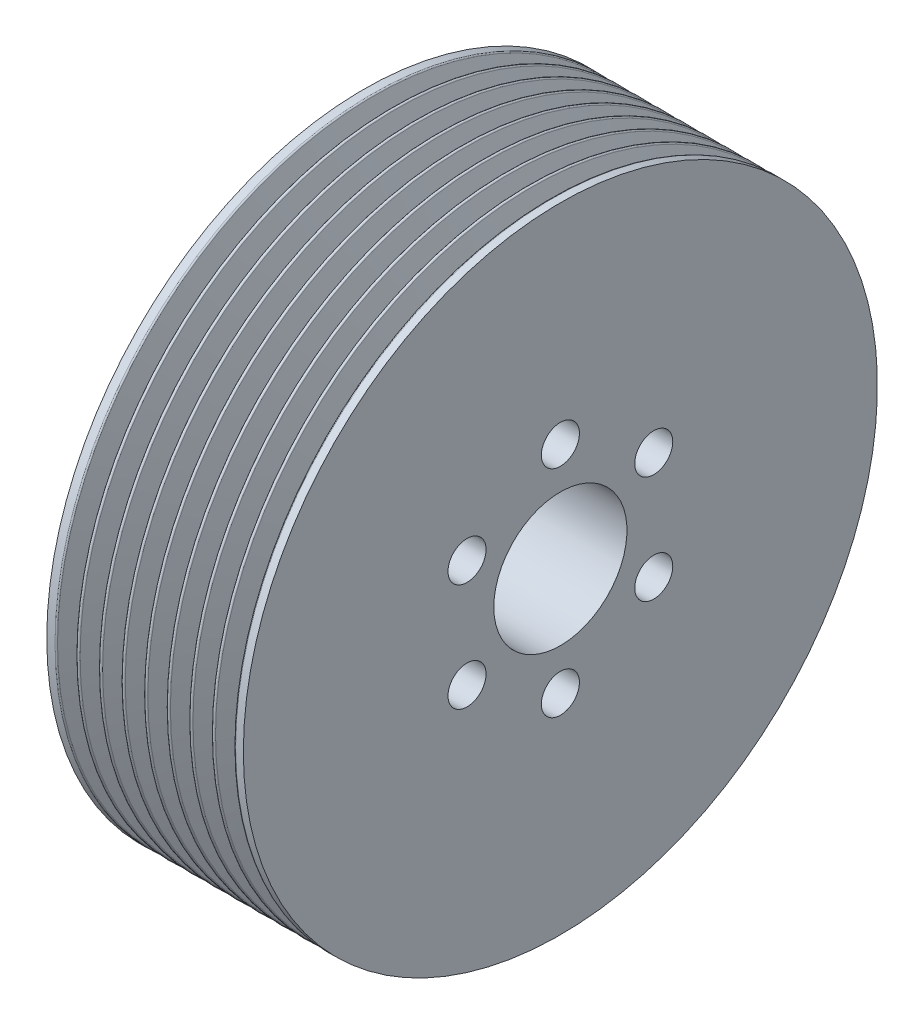
ISO-10303-21;
HEADER;
FILE_DESCRIPTION(('STEP AP214'),'2;1');
FILE_NAME('part.step','',(''),(''),'','','');
FILE_SCHEMA(('AUTOMOTIVE_DESIGN { 1 0 10303 214 1 1 1 1 }'));
ENDSEC;
DATA;
#1=APPLICATION_CONTEXT('core data for automotive mechanical design processes');
#2=APPLICATION_PROTOCOL_DEFINITION('international standard','automotive_design',2000,#1);
#3=PRODUCT_CONTEXT('',#1,'mechanical');
#4=PRODUCT('Part','Part','',(#3));
#5=PRODUCT_RELATED_PRODUCT_CATEGORY('part','',(#4));
#6=PRODUCT_DEFINITION_FORMATION('','',#4);
#7=PRODUCT_DEFINITION_CONTEXT('part definition',#1,'design');
#8=PRODUCT_DEFINITION('design','',#6,#7);
#9=PRODUCT_DEFINITION_SHAPE('','',#8);
#10=(LENGTH_UNIT() NAMED_UNIT(*) SI_UNIT(.MILLI.,.METRE.));
#11=(NAMED_UNIT(*) PLANE_ANGLE_UNIT() SI_UNIT($,.RADIAN.));
#12=(NAMED_UNIT(*) SI_UNIT($,.STERADIAN.) SOLID_ANGLE_UNIT());
#13=UNCERTAINTY_MEASURE_WITH_UNIT(LENGTH_MEASURE(1.E-05),#10,'distance_accuracy_value','');
#14=(GEOMETRIC_REPRESENTATION_CONTEXT(3) GLOBAL_UNCERTAINTY_ASSIGNED_CONTEXT((#13)) GLOBAL_UNIT_ASSIGNED_CONTEXT((#10,
#11,#12)) REPRESENTATION_CONTEXT('',''));
#15=CARTESIAN_POINT('',(0.,0.,0.));
#16=DIRECTION('',(0.,0.,1.));
#17=DIRECTION('',(1.,0.,0.));
#18=AXIS2_PLACEMENT_3D('',#15,#16,#17);
#19=CARTESIAN_POINT('',(0.,0.,0.));
#20=DIRECTION('',(-1.,0.,0.));
#21=DIRECTION('',(0.,0.,1.));
#22=AXIS2_PLACEMENT_3D('',#19,#20,#21);
#23=CYLINDRICAL_SURFACE('',#22,50.);
#24=CARTESIAN_POINT('',(18.,0.,0.));
#25=DIRECTION('',(-1.,0.,0.));
#26=DIRECTION('',(0.,0.,1.));
#27=AXIS2_PLACEMENT_3D('',#24,#25,#26);
#28=CIRCLE('',#27,50.);
#29=CARTESIAN_POINT('',(18.,0.,50.));
#30=VERTEX_POINT('',#29);
#31=EDGE_CURVE('E54',#30,#30,#28,.T.);
#32=ORIENTED_EDGE('',*,*,#31,.F.);
#33=EDGE_LOOP('',(#32));
#34=FACE_BOUND('',#33,.T.);
#35=CARTESIAN_POINT('',(19.3,0.,0.));
#36=DIRECTION('',(-1.,0.,0.));
#37=DIRECTION('',(0.,0.,1.));
#38=AXIS2_PLACEMENT_3D('',#35,#36,#37);
#39=CIRCLE('',#38,50.);
#40=CARTESIAN_POINT('',(19.3,0.,50.));
#41=VERTEX_POINT('',#40);
#42=EDGE_CURVE('E205',#41,#41,#39,.T.);
#43=ORIENTED_EDGE('',*,*,#42,.T.);
#44=EDGE_LOOP('',(#43));
#45=FACE_BOUND('',#44,.T.);
#46=ADVANCED_FACE('F41',(#34,#45),#23,.T.);
#47=CARTESIAN_POINT('',(31.5,10.5,0.));
#48=DIRECTION('',(1.,0.,0.));
#49=DIRECTION('',(0.,0.,-1.));
#50=AXIS2_PLACEMENT_3D('',#47,#48,#49);
#51=PLANE('',#50);
#52=CARTESIAN_POINT('',(31.5,8.50000000000017,14.7224318643354));
#53=DIRECTION('',(1.,0.,0.));
#54=DIRECTION('',(0.,0.,-1.));
#55=AXIS2_PLACEMENT_3D('',#52,#53,#54);
#56=CIRCLE('',#55,3.);
#57=CARTESIAN_POINT('',(31.5,8.50000000000017,11.7224318643354));
#58=VERTEX_POINT('',#57);
#59=EDGE_CURVE('E249',#58,#58,#56,.F.);
#60=ORIENTED_EDGE('',*,*,#59,.F.);
#61=EDGE_LOOP('',(#60));
#62=FACE_BOUND('',#61,.T.);
#63=CARTESIAN_POINT('',(31.5,-8.50000000000004,14.7224318643355));
#64=DIRECTION('',(1.,0.,0.));
#65=DIRECTION('',(0.,0.,-1.));
#66=AXIS2_PLACEMENT_3D('',#63,#64,#65);
#67=CIRCLE('',#66,3.);
#68=CARTESIAN_POINT('',(31.5,-8.50000000000004,11.7224318643355));
#69=VERTEX_POINT('',#68);
#70=EDGE_CURVE('E241',#69,#69,#67,.F.);
#71=ORIENTED_EDGE('',*,*,#70,.F.);
#72=EDGE_LOOP('',(#71));
#73=FACE_BOUND('',#72,.T.);
#74=CARTESIAN_POINT('',(31.5,-17.0000000000001,0.));
#75=DIRECTION('',(1.,0.,0.));
#76=DIRECTION('',(0.,0.,-1.));
#77=AXIS2_PLACEMENT_3D('',#74,#75,#76);
#78=CIRCLE('',#77,3.);
#79=CARTESIAN_POINT('',(31.5,-17.0000000000001,-2.99999999999996));
#80=VERTEX_POINT('',#79);
#81=EDGE_CURVE('E233',#80,#80,#78,.F.);
#82=ORIENTED_EDGE('',*,*,#81,.F.);
#83=EDGE_LOOP('',(#82));
#84=FACE_BOUND('',#83,.T.);
#85=CARTESIAN_POINT('',(31.5,-8.49999999999999,-14.7224318643355));
#86=DIRECTION('',(1.,0.,0.));
#87=DIRECTION('',(0.,0.,-1.));
#88=AXIS2_PLACEMENT_3D('',#85,#86,#87);
#89=CIRCLE('',#88,3.);
#90=CARTESIAN_POINT('',(31.5,-8.49999999999999,-17.7224318643355));
#91=VERTEX_POINT('',#90);
#92=EDGE_CURVE('E225',#91,#91,#89,.F.);
#93=ORIENTED_EDGE('',*,*,#92,.F.);
#94=EDGE_LOOP('',(#93));
#95=FACE_BOUND('',#94,.T.);
#96=CARTESIAN_POINT('',(31.5,8.5,-14.7224318643355));
#97=DIRECTION('',(1.,0.,0.));
#98=DIRECTION('',(0.,0.,-1.));
#99=AXIS2_PLACEMENT_3D('',#96,#97,#98);
#100=CIRCLE('',#99,3.);
#101=CARTESIAN_POINT('',(31.5,8.5,-17.7224318643355));
#102=VERTEX_POINT('',#101);
#103=EDGE_CURVE('E217',#102,#102,#100,.F.);
#104=ORIENTED_EDGE('',*,*,#103,.F.);
#105=EDGE_LOOP('',(#104));
#106=FACE_BOUND('',#105,.T.);
#107=CARTESIAN_POINT('',(31.5,17.,0.));
#108=DIRECTION('',(1.,0.,0.));
#109=DIRECTION('',(0.,0.,-1.));
#110=AXIS2_PLACEMENT_3D('',#107,#108,#109);
#111=CIRCLE('',#110,3.);
#112=CARTESIAN_POINT('',(31.5,17.,-3.));
#113=VERTEX_POINT('',#112);
#114=EDGE_CURVE('E209',#113,#113,#111,.F.);
#115=ORIENTED_EDGE('',*,*,#114,.F.);
#116=EDGE_LOOP('',(#115));
#117=FACE_BOUND('',#116,.T.);
#118=CARTESIAN_POINT('',(31.5,0.,0.));
#119=DIRECTION('',(-1.,0.,0.));
#120=DIRECTION('',(0.,0.,1.));
#121=AXIS2_PLACEMENT_3D('',#118,#119,#120);
#122=CIRCLE('',#121,10.5);
#123=CARTESIAN_POINT('',(31.5,0.,10.5));
#124=VERTEX_POINT('',#123);
#125=EDGE_CURVE('E69',#124,#124,#122,.T.);
#126=ORIENTED_EDGE('',*,*,#125,.F.);
#127=EDGE_LOOP('',(#126));
#128=FACE_BOUND('',#127,.T.);
#129=CARTESIAN_POINT('',(31.5,0.,0.));
#130=DIRECTION('',(-1.,0.,0.));
#131=DIRECTION('',(0.,0.,1.));
#132=AXIS2_PLACEMENT_3D('',#129,#130,#131);
#133=CIRCLE('',#132,21.5);
#134=CARTESIAN_POINT('',(31.5,0.,21.5));
#135=VERTEX_POINT('',#134);
#136=EDGE_CURVE('E10',#135,#135,#133,.T.);
#137=ORIENTED_EDGE('',*,*,#136,.T.);
#138=EDGE_LOOP('',(#137));
#139=FACE_BOUND('',#138,.T.);
#140=ADVANCED_FACE('F43',(#62,#73,#84,#95,#106,#117,#128,#139),#51,.F.);
#141=CARTESIAN_POINT('',(0.,0.,0.));
#142=DIRECTION('',(-1.,0.,0.));
#143=DIRECTION('',(0.,0.,1.));
#144=AXIS2_PLACEMENT_3D('',#141,#142,#143);
#145=CYLINDRICAL_SURFACE('',#144,21.5);
#146=ORIENTED_EDGE('',*,*,#136,.F.);
#147=EDGE_LOOP('',(#146));
#148=FACE_BOUND('',#147,.T.);
#149=CARTESIAN_POINT('',(18.,0.,0.));
#150=DIRECTION('',(-1.,0.,0.));
#151=DIRECTION('',(0.,0.,1.));
#152=AXIS2_PLACEMENT_3D('',#149,#150,#151);
#153=CIRCLE('',#152,21.5);
#154=CARTESIAN_POINT('',(18.,0.,21.5));
#155=VERTEX_POINT('',#154);
#156=EDGE_CURVE('E49',#155,#155,#153,.T.);
#157=ORIENTED_EDGE('',*,*,#156,.T.);
#158=EDGE_LOOP('',(#157));
#159=FACE_BOUND('',#158,.T.);
#160=ADVANCED_FACE('F287',(#148,#159),#145,.F.);
#161=CARTESIAN_POINT('',(18.,50.,0.));
#162=DIRECTION('',(1.,0.,0.));
#163=DIRECTION('',(0.,0.,-1.));
#164=AXIS2_PLACEMENT_3D('',#161,#162,#163);
#165=PLANE('',#164);
#166=ORIENTED_EDGE('',*,*,#156,.F.);
#167=EDGE_LOOP('',(#166));
#168=FACE_BOUND('',#167,.T.);
#169=ORIENTED_EDGE('',*,*,#31,.T.);
#170=EDGE_LOOP('',(#169));
#171=FACE_BOUND('',#170,.T.);
#172=ADVANCED_FACE('F293',(#168,#171),#165,.F.);
#173=CARTESIAN_POINT('',(47.78,0.,0.));
#174=DIRECTION('',(-1.,0.,0.));
#175=DIRECTION('',(0.,0.,1.));
#176=AXIS2_PLACEMENT_3D('',#173,#174,#175);
#177=CIRCLE('',#176,50.);
#178=CARTESIAN_POINT('',(47.78,0.,50.));
#179=VERTEX_POINT('',#178);
#180=EDGE_CURVE('E89',#179,#179,#177,.T.);
#181=ORIENTED_EDGE('',*,*,#180,.F.);
#182=EDGE_LOOP('',(#181));
#183=FACE_BOUND('',#182,.T.);
#184=CARTESIAN_POINT('',(49.,0.,0.));
#185=DIRECTION('',(-1.,0.,0.));
#186=DIRECTION('',(0.,0.,1.));
#187=AXIS2_PLACEMENT_3D('',#184,#185,#186);
#188=CIRCLE('',#187,50.);
#189=CARTESIAN_POINT('',(49.,0.,50.));
#190=VERTEX_POINT('',#189);
#191=EDGE_CURVE('E59',#190,#190,#188,.T.);
#192=ORIENTED_EDGE('',*,*,#191,.T.);
#193=EDGE_LOOP('',(#192));
#194=FACE_BOUND('',#193,.T.);
#195=ADVANCED_FACE('F264',(#183,#194),#23,.T.);
#196=CARTESIAN_POINT('',(49.,10.5,0.));
#197=DIRECTION('',(-1.,0.,0.));
#198=DIRECTION('',(0.,0.,1.));
#199=AXIS2_PLACEMENT_3D('',#196,#197,#198);
#200=PLANE('',#199);
#201=CARTESIAN_POINT('',(49.,8.50000000000017,14.7224318643354));
#202=DIRECTION('',(1.,0.,0.));
#203=DIRECTION('',(0.,0.,-1.));
#204=AXIS2_PLACEMENT_3D('',#201,#202,#203);
#205=CIRCLE('',#204,3.);
#206=CARTESIAN_POINT('',(49.,8.50000000000017,11.7224318643354));
#207=VERTEX_POINT('',#206);
#208=EDGE_CURVE('E253',#207,#207,#205,.T.);
#209=ORIENTED_EDGE('',*,*,#208,.F.);
#210=EDGE_LOOP('',(#209));
#211=FACE_BOUND('',#210,.T.);
#212=CARTESIAN_POINT('',(49.,-8.50000000000004,14.7224318643355));
#213=DIRECTION('',(1.,0.,0.));
#214=DIRECTION('',(0.,0.,-1.));
#215=AXIS2_PLACEMENT_3D('',#212,#213,#214);
#216=CIRCLE('',#215,3.);
#217=CARTESIAN_POINT('',(49.,-8.50000000000004,11.7224318643355));
#218=VERTEX_POINT('',#217);
#219=EDGE_CURVE('E245',#218,#218,#216,.T.);
#220=ORIENTED_EDGE('',*,*,#219,.F.);
#221=EDGE_LOOP('',(#220));
#222=FACE_BOUND('',#221,.T.);
#223=CARTESIAN_POINT('',(49.,-17.0000000000001,0.));
#224=DIRECTION('',(1.,0.,0.));
#225=DIRECTION('',(0.,0.,-1.));
#226=AXIS2_PLACEMENT_3D('',#223,#224,#225);
#227=CIRCLE('',#226,3.);
#228=CARTESIAN_POINT('',(49.,-17.0000000000001,-2.99999999999996));
#229=VERTEX_POINT('',#228);
#230=EDGE_CURVE('E237',#229,#229,#227,.T.);
#231=ORIENTED_EDGE('',*,*,#230,.F.);
#232=EDGE_LOOP('',(#231));
#233=FACE_BOUND('',#232,.T.);
#234=CARTESIAN_POINT('',(49.,-8.49999999999999,-14.7224318643355));
#235=DIRECTION('',(1.,0.,0.));
#236=DIRECTION('',(0.,0.,-1.));
#237=AXIS2_PLACEMENT_3D('',#234,#235,#236);
#238=CIRCLE('',#237,3.);
#239=CARTESIAN_POINT('',(49.,-8.49999999999999,-17.7224318643355));
#240=VERTEX_POINT('',#239);
#241=EDGE_CURVE('E229',#240,#240,#238,.T.);
#242=ORIENTED_EDGE('',*,*,#241,.F.);
#243=EDGE_LOOP('',(#242));
#244=FACE_BOUND('',#243,.T.);
#245=CARTESIAN_POINT('',(49.,8.5,-14.7224318643355));
#246=DIRECTION('',(1.,0.,0.));
#247=DIRECTION('',(0.,0.,-1.));
#248=AXIS2_PLACEMENT_3D('',#245,#246,#247);
#249=CIRCLE('',#248,3.);
#250=CARTESIAN_POINT('',(49.,8.5,-17.7224318643355));
#251=VERTEX_POINT('',#250);
#252=EDGE_CURVE('E221',#251,#251,#249,.T.);
#253=ORIENTED_EDGE('',*,*,#252,.F.);
#254=EDGE_LOOP('',(#253));
#255=FACE_BOUND('',#254,.T.);
#256=CARTESIAN_POINT('',(49.,17.,0.));
#257=DIRECTION('',(1.,0.,0.));
#258=DIRECTION('',(0.,0.,-1.));
#259=AXIS2_PLACEMENT_3D('',#256,#257,#258);
#260=CIRCLE('',#259,3.);
#261=CARTESIAN_POINT('',(49.,17.,-3.));
#262=VERTEX_POINT('',#261);
#263=EDGE_CURVE('E213',#262,#262,#260,.T.);
#264=ORIENTED_EDGE('',*,*,#263,.F.);
#265=EDGE_LOOP('',(#264));
#266=FACE_BOUND('',#265,.T.);
#267=ORIENTED_EDGE('',*,*,#191,.F.);
#268=EDGE_LOOP('',(#267));
#269=FACE_BOUND('',#268,.T.);
#270=CARTESIAN_POINT('',(49.,0.,0.));
#271=DIRECTION('',(-1.,0.,0.));
#272=DIRECTION('',(0.,0.,1.));
#273=AXIS2_PLACEMENT_3D('',#270,#271,#272);
#274=CIRCLE('',#273,10.5);
#275=CARTESIAN_POINT('',(49.,0.,10.5));
#276=VERTEX_POINT('',#275);
#277=EDGE_CURVE('E65',#276,#276,#274,.T.);
#278=ORIENTED_EDGE('',*,*,#277,.T.);
#279=EDGE_LOOP('',(#278));
#280=FACE_BOUND('',#279,.T.);
#281=ADVANCED_FACE('F260',(#211,#222,#233,#244,#255,#266,#269,#280),#200,.F.);
#282=CARTESIAN_POINT('',(0.,0.,0.));
#283=DIRECTION('',(-1.,0.,0.));
#284=DIRECTION('',(0.,0.,1.));
#285=AXIS2_PLACEMENT_3D('',#282,#283,#284);
#286=CYLINDRICAL_SURFACE('',#285,10.5);
#287=ORIENTED_EDGE('',*,*,#277,.F.);
#288=EDGE_LOOP('',(#287));
#289=FACE_BOUND('',#288,.T.);
#290=ORIENTED_EDGE('',*,*,#125,.T.);
#291=EDGE_LOOP('',(#290));
#292=FACE_BOUND('',#291,.T.);
#293=ADVANCED_FACE('F263',(#289,#292),#286,.F.);
#294=CARTESIAN_POINT('',(47.78,0.,0.));
#295=DIRECTION('',(-1.,0.,0.));
#296=DIRECTION('',(0.,0.,1.));
#297=AXIS2_PLACEMENT_3D('',#294,#295,#296);
#298=TOROIDAL_SURFACE('',#297,49.75,0.250000000000001);
#299=ORIENTED_EDGE('',*,*,#180,.T.);
#300=EDGE_LOOP('',(#299));
#301=FACE_BOUND('',#300,.T.);
#302=CARTESIAN_POINT('',(47.5450768448035,0.,0.));
#303=DIRECTION('',(-1.,0.,0.));
#304=DIRECTION('',(0.,0.,1.));
#305=AXIS2_PLACEMENT_3D('',#302,#303,#304);
#306=CIRCLE('',#305,49.8355050358314);
#307=CARTESIAN_POINT('',(47.5450768448035,0.,49.8355050358314));
#308=VERTEX_POINT('',#307);
#309=EDGE_CURVE('E73',#308,#308,#306,.T.);
#310=ORIENTED_EDGE('',*,*,#309,.F.);
#311=EDGE_LOOP('',(#310));
#312=FACE_BOUND('',#311,.T.);
#313=ADVANCED_FACE('F282',(#301,#312),#298,.T.);
#314=CARTESIAN_POINT('',(46.2819077862358,0.,0.));
#315=DIRECTION('',(1.,0.,0.));
#316=DIRECTION('',(0.,0.,-1.));
#317=AXIS2_PLACEMENT_3D('',#314,#315,#316);
#318=CONICAL_SURFACE('',#317,46.3649765704627,1.22173047639603);
#319=ORIENTED_EDGE('',*,*,#309,.T.);
#320=EDGE_LOOP('',(#319));
#321=FACE_BOUND('',#320,.T.);
#322=CARTESIAN_POINT('',(46.2819077862358,0.,0.));
#323=DIRECTION('',(-1.,0.,0.));
#324=DIRECTION('',(0.,0.,1.));
#325=AXIS2_PLACEMENT_3D('',#322,#323,#324);
#326=CIRCLE('',#325,46.3649765704627);
#327=CARTESIAN_POINT('',(46.2819077862358,0.,46.3649765704627));
#328=VERTEX_POINT('',#327);
#329=EDGE_CURVE('E77',#328,#328,#326,.T.);
#330=ORIENTED_EDGE('',*,*,#329,.F.);
#331=EDGE_LOOP('',(#330));
#332=FACE_BOUND('',#331,.T.);
#333=ADVANCED_FACE('F445',(#321,#332),#318,.T.);
#334=CARTESIAN_POINT('',(46.,0.,0.));
#335=DIRECTION('',(-1.,0.,0.));
#336=DIRECTION('',(0.,0.,1.));
#337=AXIS2_PLACEMENT_3D('',#334,#335,#336);
#338=TOROIDAL_SURFACE('',#337,46.4675826134604,0.3);
#339=ORIENTED_EDGE('',*,*,#329,.T.);
#340=EDGE_LOOP('',(#339));
#341=FACE_BOUND('',#340,.T.);
#342=CARTESIAN_POINT('',(45.7180922137642,0.,0.));
#343=DIRECTION('',(-1.,0.,0.));
#344=DIRECTION('',(0.,0.,1.));
#345=AXIS2_PLACEMENT_3D('',#342,#343,#344);
#346=CIRCLE('',#345,46.3649765704627);
#347=CARTESIAN_POINT('',(45.7180922137642,0.,46.3649765704627));
#348=VERTEX_POINT('',#347);
#349=EDGE_CURVE('E81',#348,#348,#346,.T.);
#350=ORIENTED_EDGE('',*,*,#349,.F.);
#351=EDGE_LOOP('',(#350));
#352=FACE_BOUND('',#351,.T.);
#353=ADVANCED_FACE('F441',(#341,#352),#338,.F.);
#354=CARTESIAN_POINT('',(44.4549231551965,0.,0.));
#355=DIRECTION('',(-1.,0.,0.));
#356=DIRECTION('',(0.,0.,1.));
#357=AXIS2_PLACEMENT_3D('',#354,#355,#356);
#358=CONICAL_SURFACE('',#357,49.8355050358314,1.22173047639604);
#359=ORIENTED_EDGE('',*,*,#349,.T.);
#360=EDGE_LOOP('',(#359));
#361=FACE_BOUND('',#360,.T.);
#362=CARTESIAN_POINT('',(44.4549231551965,0.,0.));
#363=DIRECTION('',(-1.,0.,0.));
#364=DIRECTION('',(0.,0.,1.));
#365=AXIS2_PLACEMENT_3D('',#362,#363,#364);
#366=CIRCLE('',#365,49.8355050358314);
#367=CARTESIAN_POINT('',(44.4549231551965,0.,49.8355050358314));
#368=VERTEX_POINT('',#367);
#369=EDGE_CURVE('E85',#368,#368,#366,.T.);
#370=ORIENTED_EDGE('',*,*,#369,.F.);
#371=EDGE_LOOP('',(#370));
#372=FACE_BOUND('',#371,.T.);
#373=ADVANCED_FACE('F437',(#361,#372),#358,.T.);
#374=CARTESIAN_POINT('',(44.22,0.,0.));
#375=DIRECTION('',(-1.,0.,0.));
#376=DIRECTION('',(0.,0.,1.));
#377=AXIS2_PLACEMENT_3D('',#374,#375,#376);
#378=TOROIDAL_SURFACE('',#377,49.75,0.250000000000001);
#379=ORIENTED_EDGE('',*,*,#369,.T.);
#380=EDGE_LOOP('',(#379));
#381=FACE_BOUND('',#380,.T.);
#382=CARTESIAN_POINT('',(43.9850768448035,0.,0.));
#383=DIRECTION('',(-1.,0.,0.));
#384=DIRECTION('',(0.,0.,1.));
#385=AXIS2_PLACEMENT_3D('',#382,#383,#384);
#386=CIRCLE('',#385,49.8355050358314);
#387=CARTESIAN_POINT('',(43.9850768448035,0.,49.8355050358314));
#388=VERTEX_POINT('',#387);
#389=EDGE_CURVE('E93',#388,#388,#386,.T.);
#390=ORIENTED_EDGE('',*,*,#389,.F.);
#391=EDGE_LOOP('',(#390));
#392=FACE_BOUND('',#391,.T.);
#393=ADVANCED_FACE('F433',(#381,#392),#378,.T.);
#394=CARTESIAN_POINT('',(42.7219077862358,0.,0.));
#395=DIRECTION('',(1.,0.,0.));
#396=DIRECTION('',(0.,0.,-1.));
#397=AXIS2_PLACEMENT_3D('',#394,#395,#396);
#398=CONICAL_SURFACE('',#397,46.3649765704627,1.22173047639603);
#399=ORIENTED_EDGE('',*,*,#389,.T.);
#400=EDGE_LOOP('',(#399));
#401=FACE_BOUND('',#400,.T.);
#402=CARTESIAN_POINT('',(42.7219077862358,0.,0.));
#403=DIRECTION('',(-1.,0.,0.));
#404=DIRECTION('',(0.,0.,1.));
#405=AXIS2_PLACEMENT_3D('',#402,#403,#404);
#406=CIRCLE('',#405,46.3649765704627);
#407=CARTESIAN_POINT('',(42.7219077862358,0.,46.3649765704627));
#408=VERTEX_POINT('',#407);
#409=EDGE_CURVE('E97',#408,#408,#406,.T.);
#410=ORIENTED_EDGE('',*,*,#409,.F.);
#411=EDGE_LOOP('',(#410));
#412=FACE_BOUND('',#411,.T.);
#413=ADVANCED_FACE('F429',(#401,#412),#398,.T.);
#414=CARTESIAN_POINT('',(42.44,0.,0.));
#415=DIRECTION('',(-1.,0.,0.));
#416=DIRECTION('',(0.,0.,1.));
#417=AXIS2_PLACEMENT_3D('',#414,#415,#416);
#418=TOROIDAL_SURFACE('',#417,46.4675826134604,0.3);
#419=ORIENTED_EDGE('',*,*,#409,.T.);
#420=EDGE_LOOP('',(#419));
#421=FACE_BOUND('',#420,.T.);
#422=CARTESIAN_POINT('',(42.1580922137642,0.,0.));
#423=DIRECTION('',(-1.,0.,0.));
#424=DIRECTION('',(0.,0.,1.));
#425=AXIS2_PLACEMENT_3D('',#422,#423,#424);
#426=CIRCLE('',#425,46.3649765704627);
#427=CARTESIAN_POINT('',(42.1580922137642,0.,46.3649765704627));
#428=VERTEX_POINT('',#427);
#429=EDGE_CURVE('E101',#428,#428,#426,.T.);
#430=ORIENTED_EDGE('',*,*,#429,.F.);
#431=EDGE_LOOP('',(#430));
#432=FACE_BOUND('',#431,.T.);
#433=ADVANCED_FACE('F425',(#421,#432),#418,.F.);
#434=CARTESIAN_POINT('',(40.8949231551965,0.,0.));
#435=DIRECTION('',(-1.,0.,0.));
#436=DIRECTION('',(0.,0.,1.));
#437=AXIS2_PLACEMENT_3D('',#434,#435,#436);
#438=CONICAL_SURFACE('',#437,49.8355050358314,1.22173047639604);
#439=ORIENTED_EDGE('',*,*,#429,.T.);
#440=EDGE_LOOP('',(#439));
#441=FACE_BOUND('',#440,.T.);
#442=CARTESIAN_POINT('',(40.8949231551965,0.,0.));
#443=DIRECTION('',(-1.,0.,0.));
#444=DIRECTION('',(0.,0.,1.));
#445=AXIS2_PLACEMENT_3D('',#442,#443,#444);
#446=CIRCLE('',#445,49.8355050358314);
#447=CARTESIAN_POINT('',(40.8949231551965,0.,49.8355050358314));
#448=VERTEX_POINT('',#447);
#449=EDGE_CURVE('E105',#448,#448,#446,.T.);
#450=ORIENTED_EDGE('',*,*,#449,.F.);
#451=EDGE_LOOP('',(#450));
#452=FACE_BOUND('',#451,.T.);
#453=ADVANCED_FACE('F421',(#441,#452),#438,.T.);
#454=CARTESIAN_POINT('',(40.66,0.,0.));
#455=DIRECTION('',(-1.,0.,0.));
#456=DIRECTION('',(0.,0.,1.));
#457=AXIS2_PLACEMENT_3D('',#454,#455,#456);
#458=TOROIDAL_SURFACE('',#457,49.75,0.250000000000001);
#459=ORIENTED_EDGE('',*,*,#449,.T.);
#460=EDGE_LOOP('',(#459));
#461=FACE_BOUND('',#460,.T.);
#462=CARTESIAN_POINT('',(40.4250768448035,0.,0.));
#463=DIRECTION('',(-1.,0.,0.));
#464=DIRECTION('',(0.,0.,1.));
#465=AXIS2_PLACEMENT_3D('',#462,#463,#464);
#466=CIRCLE('',#465,49.8355050358314);
#467=CARTESIAN_POINT('',(40.4250768448035,0.,49.8355050358314));
#468=VERTEX_POINT('',#467);
#469=EDGE_CURVE('E109',#468,#468,#466,.T.);
#470=ORIENTED_EDGE('',*,*,#469,.F.);
#471=EDGE_LOOP('',(#470));
#472=FACE_BOUND('',#471,.T.);
#473=ADVANCED_FACE('F417',(#461,#472),#458,.T.);
#474=CARTESIAN_POINT('',(39.1619077862358,0.,0.));
#475=DIRECTION('',(1.,0.,0.));
#476=DIRECTION('',(0.,0.,-1.));
#477=AXIS2_PLACEMENT_3D('',#474,#475,#476);
#478=CONICAL_SURFACE('',#477,46.3649765704627,1.22173047639603);
#479=ORIENTED_EDGE('',*,*,#469,.T.);
#480=EDGE_LOOP('',(#479));
#481=FACE_BOUND('',#480,.T.);
#482=CARTESIAN_POINT('',(39.1619077862358,0.,0.));
#483=DIRECTION('',(-1.,0.,0.));
#484=DIRECTION('',(0.,0.,1.));
#485=AXIS2_PLACEMENT_3D('',#482,#483,#484);
#486=CIRCLE('',#485,46.3649765704627);
#487=CARTESIAN_POINT('',(39.1619077862358,0.,46.3649765704627));
#488=VERTEX_POINT('',#487);
#489=EDGE_CURVE('E113',#488,#488,#486,.T.);
#490=ORIENTED_EDGE('',*,*,#489,.F.);
#491=EDGE_LOOP('',(#490));
#492=FACE_BOUND('',#491,.T.);
#493=ADVANCED_FACE('F413',(#481,#492),#478,.T.);
#494=CARTESIAN_POINT('',(38.88,0.,0.));
#495=DIRECTION('',(-1.,0.,0.));
#496=DIRECTION('',(0.,0.,1.));
#497=AXIS2_PLACEMENT_3D('',#494,#495,#496);
#498=TOROIDAL_SURFACE('',#497,46.4675826134604,0.3);
#499=ORIENTED_EDGE('',*,*,#489,.T.);
#500=EDGE_LOOP('',(#499));
#501=FACE_BOUND('',#500,.T.);
#502=CARTESIAN_POINT('',(38.5980922137642,0.,0.));
#503=DIRECTION('',(-1.,0.,0.));
#504=DIRECTION('',(0.,0.,1.));
#505=AXIS2_PLACEMENT_3D('',#502,#503,#504);
#506=CIRCLE('',#505,46.3649765704627);
#507=CARTESIAN_POINT('',(38.5980922137642,0.,46.3649765704627));
#508=VERTEX_POINT('',#507);
#509=EDGE_CURVE('E117',#508,#508,#506,.T.);
#510=ORIENTED_EDGE('',*,*,#509,.F.);
#511=EDGE_LOOP('',(#510));
#512=FACE_BOUND('',#511,.T.);
#513=ADVANCED_FACE('F409',(#501,#512),#498,.F.);
#514=CARTESIAN_POINT('',(37.3349231551965,0.,0.));
#515=DIRECTION('',(-1.,0.,0.));
#516=DIRECTION('',(0.,0.,1.));
#517=AXIS2_PLACEMENT_3D('',#514,#515,#516);
#518=CONICAL_SURFACE('',#517,49.8355050358314,1.22173047639604);
#519=ORIENTED_EDGE('',*,*,#509,.T.);
#520=EDGE_LOOP('',(#519));
#521=FACE_BOUND('',#520,.T.);
#522=CARTESIAN_POINT('',(37.3349231551965,0.,0.));
#523=DIRECTION('',(-1.,0.,0.));
#524=DIRECTION('',(0.,0.,1.));
#525=AXIS2_PLACEMENT_3D('',#522,#523,#524);
#526=CIRCLE('',#525,49.8355050358314);
#527=CARTESIAN_POINT('',(37.3349231551965,0.,49.8355050358314));
#528=VERTEX_POINT('',#527);
#529=EDGE_CURVE('E121',#528,#528,#526,.T.);
#530=ORIENTED_EDGE('',*,*,#529,.F.);
#531=EDGE_LOOP('',(#530));
#532=FACE_BOUND('',#531,.T.);
#533=ADVANCED_FACE('F405',(#521,#532),#518,.T.);
#534=CARTESIAN_POINT('',(37.1,0.,0.));
#535=DIRECTION('',(-1.,0.,0.));
#536=DIRECTION('',(0.,0.,1.));
#537=AXIS2_PLACEMENT_3D('',#534,#535,#536);
#538=TOROIDAL_SURFACE('',#537,49.75,0.250000000000001);
#539=ORIENTED_EDGE('',*,*,#529,.T.);
#540=EDGE_LOOP('',(#539));
#541=FACE_BOUND('',#540,.T.);
#542=CARTESIAN_POINT('',(36.8650768448035,0.,0.));
#543=DIRECTION('',(-1.,0.,0.));
#544=DIRECTION('',(0.,0.,1.));
#545=AXIS2_PLACEMENT_3D('',#542,#543,#544);
#546=CIRCLE('',#545,49.8355050358314);
#547=CARTESIAN_POINT('',(36.8650768448035,0.,49.8355050358314));
#548=VERTEX_POINT('',#547);
#549=EDGE_CURVE('E125',#548,#548,#546,.T.);
#550=ORIENTED_EDGE('',*,*,#549,.F.);
#551=EDGE_LOOP('',(#550));
#552=FACE_BOUND('',#551,.T.);
#553=ADVANCED_FACE('F401',(#541,#552),#538,.T.);
#554=CARTESIAN_POINT('',(35.6019077862358,0.,0.));
#555=DIRECTION('',(1.,0.,0.));
#556=DIRECTION('',(0.,0.,-1.));
#557=AXIS2_PLACEMENT_3D('',#554,#555,#556);
#558=CONICAL_SURFACE('',#557,46.3649765704627,1.22173047639603);
#559=ORIENTED_EDGE('',*,*,#549,.T.);
#560=EDGE_LOOP('',(#559));
#561=FACE_BOUND('',#560,.T.);
#562=CARTESIAN_POINT('',(35.6019077862358,0.,0.));
#563=DIRECTION('',(-1.,0.,0.));
#564=DIRECTION('',(0.,0.,1.));
#565=AXIS2_PLACEMENT_3D('',#562,#563,#564);
#566=CIRCLE('',#565,46.3649765704627);
#567=CARTESIAN_POINT('',(35.6019077862358,0.,46.3649765704627));
#568=VERTEX_POINT('',#567);
#569=EDGE_CURVE('E129',#568,#568,#566,.T.);
#570=ORIENTED_EDGE('',*,*,#569,.F.);
#571=EDGE_LOOP('',(#570));
#572=FACE_BOUND('',#571,.T.);
#573=ADVANCED_FACE('F397',(#561,#572),#558,.T.);
#574=CARTESIAN_POINT('',(35.32,0.,0.));
#575=DIRECTION('',(-1.,0.,0.));
#576=DIRECTION('',(0.,0.,1.));
#577=AXIS2_PLACEMENT_3D('',#574,#575,#576);
#578=TOROIDAL_SURFACE('',#577,46.4675826134604,0.3);
#579=ORIENTED_EDGE('',*,*,#569,.T.);
#580=EDGE_LOOP('',(#579));
#581=FACE_BOUND('',#580,.T.);
#582=CARTESIAN_POINT('',(35.0380922137642,0.,0.));
#583=DIRECTION('',(-1.,0.,0.));
#584=DIRECTION('',(0.,0.,1.));
#585=AXIS2_PLACEMENT_3D('',#582,#583,#584);
#586=CIRCLE('',#585,46.3649765704627);
#587=CARTESIAN_POINT('',(35.0380922137642,0.,46.3649765704627));
#588=VERTEX_POINT('',#587);
#589=EDGE_CURVE('E133',#588,#588,#586,.T.);
#590=ORIENTED_EDGE('',*,*,#589,.F.);
#591=EDGE_LOOP('',(#590));
#592=FACE_BOUND('',#591,.T.);
#593=ADVANCED_FACE('F393',(#581,#592),#578,.F.);
#594=CARTESIAN_POINT('',(33.7749231551965,0.,0.));
#595=DIRECTION('',(-1.,0.,0.));
#596=DIRECTION('',(0.,0.,1.));
#597=AXIS2_PLACEMENT_3D('',#594,#595,#596);
#598=CONICAL_SURFACE('',#597,49.8355050358314,1.22173047639604);
#599=ORIENTED_EDGE('',*,*,#589,.T.);
#600=EDGE_LOOP('',(#599));
#601=FACE_BOUND('',#600,.T.);
#602=CARTESIAN_POINT('',(33.7749231551965,0.,0.));
#603=DIRECTION('',(-1.,0.,0.));
#604=DIRECTION('',(0.,0.,1.));
#605=AXIS2_PLACEMENT_3D('',#602,#603,#604);
#606=CIRCLE('',#605,49.8355050358314);
#607=CARTESIAN_POINT('',(33.7749231551965,0.,49.8355050358314));
#608=VERTEX_POINT('',#607);
#609=EDGE_CURVE('E137',#608,#608,#606,.T.);
#610=ORIENTED_EDGE('',*,*,#609,.F.);
#611=EDGE_LOOP('',(#610));
#612=FACE_BOUND('',#611,.T.);
#613=ADVANCED_FACE('F389',(#601,#612),#598,.T.);
#614=CARTESIAN_POINT('',(33.54,0.,0.));
#615=DIRECTION('',(-1.,0.,0.));
#616=DIRECTION('',(0.,0.,1.));
#617=AXIS2_PLACEMENT_3D('',#614,#615,#616);
#618=TOROIDAL_SURFACE('',#617,49.75,0.250000000000001);
#619=ORIENTED_EDGE('',*,*,#609,.T.);
#620=EDGE_LOOP('',(#619));
#621=FACE_BOUND('',#620,.T.);
#622=CARTESIAN_POINT('',(33.3050768448035,0.,0.));
#623=DIRECTION('',(-1.,0.,0.));
#624=DIRECTION('',(0.,0.,1.));
#625=AXIS2_PLACEMENT_3D('',#622,#623,#624);
#626=CIRCLE('',#625,49.8355050358314);
#627=CARTESIAN_POINT('',(33.3050768448035,0.,49.8355050358314));
#628=VERTEX_POINT('',#627);
#629=EDGE_CURVE('E141',#628,#628,#626,.T.);
#630=ORIENTED_EDGE('',*,*,#629,.F.);
#631=EDGE_LOOP('',(#630));
#632=FACE_BOUND('',#631,.T.);
#633=ADVANCED_FACE('F385',(#621,#632),#618,.T.);
#634=CARTESIAN_POINT('',(32.0419077862358,0.,0.));
#635=DIRECTION('',(1.,0.,0.));
#636=DIRECTION('',(0.,0.,-1.));
#637=AXIS2_PLACEMENT_3D('',#634,#635,#636);
#638=CONICAL_SURFACE('',#637,46.3649765704627,1.22173047639603);
#639=ORIENTED_EDGE('',*,*,#629,.T.);
#640=EDGE_LOOP('',(#639));
#641=FACE_BOUND('',#640,.T.);
#642=CARTESIAN_POINT('',(32.0419077862358,0.,0.));
#643=DIRECTION('',(-1.,0.,0.));
#644=DIRECTION('',(0.,0.,1.));
#645=AXIS2_PLACEMENT_3D('',#642,#643,#644);
#646=CIRCLE('',#645,46.3649765704627);
#647=CARTESIAN_POINT('',(32.0419077862358,0.,46.3649765704627));
#648=VERTEX_POINT('',#647);
#649=EDGE_CURVE('E145',#648,#648,#646,.T.);
#650=ORIENTED_EDGE('',*,*,#649,.F.);
#651=EDGE_LOOP('',(#650));
#652=FACE_BOUND('',#651,.T.);
#653=ADVANCED_FACE('F381',(#641,#652),#638,.T.);
#654=CARTESIAN_POINT('',(31.76,0.,0.));
#655=DIRECTION('',(-1.,0.,0.));
#656=DIRECTION('',(0.,0.,1.));
#657=AXIS2_PLACEMENT_3D('',#654,#655,#656);
#658=TOROIDAL_SURFACE('',#657,46.4675826134604,0.3);
#659=ORIENTED_EDGE('',*,*,#649,.T.);
#660=EDGE_LOOP('',(#659));
#661=FACE_BOUND('',#660,.T.);
#662=CARTESIAN_POINT('',(31.4780922137642,0.,0.));
#663=DIRECTION('',(-1.,0.,0.));
#664=DIRECTION('',(0.,0.,1.));
#665=AXIS2_PLACEMENT_3D('',#662,#663,#664);
#666=CIRCLE('',#665,46.3649765704627);
#667=CARTESIAN_POINT('',(31.4780922137642,0.,46.3649765704627));
#668=VERTEX_POINT('',#667);
#669=EDGE_CURVE('E149',#668,#668,#666,.T.);
#670=ORIENTED_EDGE('',*,*,#669,.F.);
#671=EDGE_LOOP('',(#670));
#672=FACE_BOUND('',#671,.T.);
#673=ADVANCED_FACE('F377',(#661,#672),#658,.F.);
#674=CARTESIAN_POINT('',(30.2149231551965,0.,0.));
#675=DIRECTION('',(-1.,0.,0.));
#676=DIRECTION('',(0.,0.,1.));
#677=AXIS2_PLACEMENT_3D('',#674,#675,#676);
#678=CONICAL_SURFACE('',#677,49.8355050358314,1.22173047639604);
#679=ORIENTED_EDGE('',*,*,#669,.T.);
#680=EDGE_LOOP('',(#679));
#681=FACE_BOUND('',#680,.T.);
#682=CARTESIAN_POINT('',(30.2149231551965,0.,0.));
#683=DIRECTION('',(-1.,0.,0.));
#684=DIRECTION('',(0.,0.,1.));
#685=AXIS2_PLACEMENT_3D('',#682,#683,#684);
#686=CIRCLE('',#685,49.8355050358314);
#687=CARTESIAN_POINT('',(30.2149231551965,0.,49.8355050358314));
#688=VERTEX_POINT('',#687);
#689=EDGE_CURVE('E153',#688,#688,#686,.T.);
#690=ORIENTED_EDGE('',*,*,#689,.F.);
#691=EDGE_LOOP('',(#690));
#692=FACE_BOUND('',#691,.T.);
#693=ADVANCED_FACE('F373',(#681,#692),#678,.T.);
#694=CARTESIAN_POINT('',(29.98,0.,0.));
#695=DIRECTION('',(-1.,0.,0.));
#696=DIRECTION('',(0.,0.,1.));
#697=AXIS2_PLACEMENT_3D('',#694,#695,#696);
#698=TOROIDAL_SURFACE('',#697,49.75,0.250000000000001);
#699=ORIENTED_EDGE('',*,*,#689,.T.);
#700=EDGE_LOOP('',(#699));
#701=FACE_BOUND('',#700,.T.);
#702=CARTESIAN_POINT('',(29.7450768448035,0.,0.));
#703=DIRECTION('',(-1.,0.,0.));
#704=DIRECTION('',(0.,0.,1.));
#705=AXIS2_PLACEMENT_3D('',#702,#703,#704);
#706=CIRCLE('',#705,49.8355050358314);
#707=CARTESIAN_POINT('',(29.7450768448035,0.,49.8355050358314));
#708=VERTEX_POINT('',#707);
#709=EDGE_CURVE('E157',#708,#708,#706,.T.);
#710=ORIENTED_EDGE('',*,*,#709,.F.);
#711=EDGE_LOOP('',(#710));
#712=FACE_BOUND('',#711,.T.);
#713=ADVANCED_FACE('F369',(#701,#712),#698,.T.);
#714=CARTESIAN_POINT('',(28.4819077862358,0.,0.));
#715=DIRECTION('',(1.,0.,0.));
#716=DIRECTION('',(0.,0.,-1.));
#717=AXIS2_PLACEMENT_3D('',#714,#715,#716);
#718=CONICAL_SURFACE('',#717,46.3649765704627,1.22173047639603);
#719=ORIENTED_EDGE('',*,*,#709,.T.);
#720=EDGE_LOOP('',(#719));
#721=FACE_BOUND('',#720,.T.);
#722=CARTESIAN_POINT('',(28.4819077862358,0.,0.));
#723=DIRECTION('',(-1.,0.,0.));
#724=DIRECTION('',(0.,0.,1.));
#725=AXIS2_PLACEMENT_3D('',#722,#723,#724);
#726=CIRCLE('',#725,46.3649765704627);
#727=CARTESIAN_POINT('',(28.4819077862358,0.,46.3649765704627));
#728=VERTEX_POINT('',#727);
#729=EDGE_CURVE('E161',#728,#728,#726,.T.);
#730=ORIENTED_EDGE('',*,*,#729,.F.);
#731=EDGE_LOOP('',(#730));
#732=FACE_BOUND('',#731,.T.);
#733=ADVANCED_FACE('F365',(#721,#732),#718,.T.);
#734=CARTESIAN_POINT('',(28.2,0.,0.));
#735=DIRECTION('',(-1.,0.,0.));
#736=DIRECTION('',(0.,0.,1.));
#737=AXIS2_PLACEMENT_3D('',#734,#735,#736);
#738=TOROIDAL_SURFACE('',#737,46.4675826134604,0.3);
#739=ORIENTED_EDGE('',*,*,#729,.T.);
#740=EDGE_LOOP('',(#739));
#741=FACE_BOUND('',#740,.T.);
#742=CARTESIAN_POINT('',(27.9180922137642,0.,0.));
#743=DIRECTION('',(-1.,0.,0.));
#744=DIRECTION('',(0.,0.,1.));
#745=AXIS2_PLACEMENT_3D('',#742,#743,#744);
#746=CIRCLE('',#745,46.3649765704627);
#747=CARTESIAN_POINT('',(27.9180922137642,0.,46.3649765704627));
#748=VERTEX_POINT('',#747);
#749=EDGE_CURVE('E165',#748,#748,#746,.T.);
#750=ORIENTED_EDGE('',*,*,#749,.F.);
#751=EDGE_LOOP('',(#750));
#752=FACE_BOUND('',#751,.T.);
#753=ADVANCED_FACE('F361',(#741,#752),#738,.F.);
#754=CARTESIAN_POINT('',(26.6549231551965,0.,0.));
#755=DIRECTION('',(-1.,0.,0.));
#756=DIRECTION('',(0.,0.,1.));
#757=AXIS2_PLACEMENT_3D('',#754,#755,#756);
#758=CONICAL_SURFACE('',#757,49.8355050358314,1.22173047639604);
#759=ORIENTED_EDGE('',*,*,#749,.T.);
#760=EDGE_LOOP('',(#759));
#761=FACE_BOUND('',#760,.T.);
#762=CARTESIAN_POINT('',(26.6549231551965,0.,0.));
#763=DIRECTION('',(-1.,0.,0.));
#764=DIRECTION('',(0.,0.,1.));
#765=AXIS2_PLACEMENT_3D('',#762,#763,#764);
#766=CIRCLE('',#765,49.8355050358314);
#767=CARTESIAN_POINT('',(26.6549231551965,0.,49.8355050358314));
#768=VERTEX_POINT('',#767);
#769=EDGE_CURVE('E169',#768,#768,#766,.T.);
#770=ORIENTED_EDGE('',*,*,#769,.F.);
#771=EDGE_LOOP('',(#770));
#772=FACE_BOUND('',#771,.T.);
#773=ADVANCED_FACE('F357',(#761,#772),#758,.T.);
#774=CARTESIAN_POINT('',(26.42,0.,0.));
#775=DIRECTION('',(-1.,0.,0.));
#776=DIRECTION('',(0.,0.,1.));
#777=AXIS2_PLACEMENT_3D('',#774,#775,#776);
#778=TOROIDAL_SURFACE('',#777,49.75,0.250000000000001);
#779=ORIENTED_EDGE('',*,*,#769,.T.);
#780=EDGE_LOOP('',(#779));
#781=FACE_BOUND('',#780,.T.);
#782=CARTESIAN_POINT('',(26.1850768448035,0.,0.));
#783=DIRECTION('',(-1.,0.,0.));
#784=DIRECTION('',(0.,0.,1.));
#785=AXIS2_PLACEMENT_3D('',#782,#783,#784);
#786=CIRCLE('',#785,49.8355050358314);
#787=CARTESIAN_POINT('',(26.1850768448035,0.,49.8355050358314));
#788=VERTEX_POINT('',#787);
#789=EDGE_CURVE('E173',#788,#788,#786,.T.);
#790=ORIENTED_EDGE('',*,*,#789,.F.);
#791=EDGE_LOOP('',(#790));
#792=FACE_BOUND('',#791,.T.);
#793=ADVANCED_FACE('F353',(#781,#792),#778,.T.);
#794=CARTESIAN_POINT('',(24.9219077862358,0.,0.));
#795=DIRECTION('',(1.,0.,0.));
#796=DIRECTION('',(0.,0.,-1.));
#797=AXIS2_PLACEMENT_3D('',#794,#795,#796);
#798=CONICAL_SURFACE('',#797,46.3649765704627,1.22173047639603);
#799=ORIENTED_EDGE('',*,*,#789,.T.);
#800=EDGE_LOOP('',(#799));
#801=FACE_BOUND('',#800,.T.);
#802=CARTESIAN_POINT('',(24.9219077862358,0.,0.));
#803=DIRECTION('',(-1.,0.,0.));
#804=DIRECTION('',(0.,0.,1.));
#805=AXIS2_PLACEMENT_3D('',#802,#803,#804);
#806=CIRCLE('',#805,46.3649765704627);
#807=CARTESIAN_POINT('',(24.9219077862358,0.,46.3649765704627));
#808=VERTEX_POINT('',#807);
#809=EDGE_CURVE('E177',#808,#808,#806,.T.);
#810=ORIENTED_EDGE('',*,*,#809,.F.);
#811=EDGE_LOOP('',(#810));
#812=FACE_BOUND('',#811,.T.);
#813=ADVANCED_FACE('F349',(#801,#812),#798,.T.);
#814=CARTESIAN_POINT('',(24.64,0.,0.));
#815=DIRECTION('',(-1.,0.,0.));
#816=DIRECTION('',(0.,0.,1.));
#817=AXIS2_PLACEMENT_3D('',#814,#815,#816);
#818=TOROIDAL_SURFACE('',#817,46.4675826134604,0.3);
#819=ORIENTED_EDGE('',*,*,#809,.T.);
#820=EDGE_LOOP('',(#819));
#821=FACE_BOUND('',#820,.T.);
#822=CARTESIAN_POINT('',(24.3580922137642,0.,0.));
#823=DIRECTION('',(-1.,0.,0.));
#824=DIRECTION('',(0.,0.,1.));
#825=AXIS2_PLACEMENT_3D('',#822,#823,#824);
#826=CIRCLE('',#825,46.3649765704627);
#827=CARTESIAN_POINT('',(24.3580922137642,0.,46.3649765704627));
#828=VERTEX_POINT('',#827);
#829=EDGE_CURVE('E181',#828,#828,#826,.T.);
#830=ORIENTED_EDGE('',*,*,#829,.F.);
#831=EDGE_LOOP('',(#830));
#832=FACE_BOUND('',#831,.T.);
#833=ADVANCED_FACE('F345',(#821,#832),#818,.F.);
#834=CARTESIAN_POINT('',(23.0949231551965,0.,0.));
#835=DIRECTION('',(-1.,0.,0.));
#836=DIRECTION('',(0.,0.,1.));
#837=AXIS2_PLACEMENT_3D('',#834,#835,#836);
#838=CONICAL_SURFACE('',#837,49.8355050358314,1.22173047639604);
#839=ORIENTED_EDGE('',*,*,#829,.T.);
#840=EDGE_LOOP('',(#839));
#841=FACE_BOUND('',#840,.T.);
#842=CARTESIAN_POINT('',(23.0949231551965,0.,0.));
#843=DIRECTION('',(-1.,0.,0.));
#844=DIRECTION('',(0.,0.,1.));
#845=AXIS2_PLACEMENT_3D('',#842,#843,#844);
#846=CIRCLE('',#845,49.8355050358314);
#847=CARTESIAN_POINT('',(23.0949231551965,0.,49.8355050358314));
#848=VERTEX_POINT('',#847);
#849=EDGE_CURVE('E185',#848,#848,#846,.T.);
#850=ORIENTED_EDGE('',*,*,#849,.F.);
#851=EDGE_LOOP('',(#850));
#852=FACE_BOUND('',#851,.T.);
#853=ADVANCED_FACE('F341',(#841,#852),#838,.T.);
#854=CARTESIAN_POINT('',(22.86,0.,0.));
#855=DIRECTION('',(-1.,0.,0.));
#856=DIRECTION('',(0.,0.,1.));
#857=AXIS2_PLACEMENT_3D('',#854,#855,#856);
#858=TOROIDAL_SURFACE('',#857,49.75,0.250000000000001);
#859=ORIENTED_EDGE('',*,*,#849,.T.);
#860=EDGE_LOOP('',(#859));
#861=FACE_BOUND('',#860,.T.);
#862=CARTESIAN_POINT('',(22.6250768448035,0.,0.));
#863=DIRECTION('',(-1.,0.,0.));
#864=DIRECTION('',(0.,0.,1.));
#865=AXIS2_PLACEMENT_3D('',#862,#863,#864);
#866=CIRCLE('',#865,49.8355050358314);
#867=CARTESIAN_POINT('',(22.6250768448035,0.,49.8355050358314));
#868=VERTEX_POINT('',#867);
#869=EDGE_CURVE('E189',#868,#868,#866,.T.);
#870=ORIENTED_EDGE('',*,*,#869,.F.);
#871=EDGE_LOOP('',(#870));
#872=FACE_BOUND('',#871,.T.);
#873=ADVANCED_FACE('F337',(#861,#872),#858,.T.);
#874=CARTESIAN_POINT('',(21.3619077862358,0.,0.));
#875=DIRECTION('',(1.,0.,0.));
#876=DIRECTION('',(0.,0.,-1.));
#877=AXIS2_PLACEMENT_3D('',#874,#875,#876);
#878=CONICAL_SURFACE('',#877,46.3649765704627,1.22173047639603);
#879=ORIENTED_EDGE('',*,*,#869,.T.);
#880=EDGE_LOOP('',(#879));
#881=FACE_BOUND('',#880,.T.);
#882=CARTESIAN_POINT('',(21.3619077862358,0.,0.));
#883=DIRECTION('',(-1.,0.,0.));
#884=DIRECTION('',(0.,0.,1.));
#885=AXIS2_PLACEMENT_3D('',#882,#883,#884);
#886=CIRCLE('',#885,46.3649765704627);
#887=CARTESIAN_POINT('',(21.3619077862358,0.,46.3649765704627));
#888=VERTEX_POINT('',#887);
#889=EDGE_CURVE('E193',#888,#888,#886,.T.);
#890=ORIENTED_EDGE('',*,*,#889,.F.);
#891=EDGE_LOOP('',(#890));
#892=FACE_BOUND('',#891,.T.);
#893=ADVANCED_FACE('F333',(#881,#892),#878,.T.);
#894=CARTESIAN_POINT('',(21.08,0.,0.));
#895=DIRECTION('',(-1.,0.,0.));
#896=DIRECTION('',(0.,0.,1.));
#897=AXIS2_PLACEMENT_3D('',#894,#895,#896);
#898=TOROIDAL_SURFACE('',#897,46.4675826134604,0.3);
#899=ORIENTED_EDGE('',*,*,#889,.T.);
#900=EDGE_LOOP('',(#899));
#901=FACE_BOUND('',#900,.T.);
#902=CARTESIAN_POINT('',(20.7980922137642,0.,0.));
#903=DIRECTION('',(-1.,0.,0.));
#904=DIRECTION('',(0.,0.,1.));
#905=AXIS2_PLACEMENT_3D('',#902,#903,#904);
#906=CIRCLE('',#905,46.3649765704627);
#907=CARTESIAN_POINT('',(20.7980922137642,0.,46.3649765704627));
#908=VERTEX_POINT('',#907);
#909=EDGE_CURVE('E197',#908,#908,#906,.T.);
#910=ORIENTED_EDGE('',*,*,#909,.F.);
#911=EDGE_LOOP('',(#910));
#912=FACE_BOUND('',#911,.T.);
#913=ADVANCED_FACE('F329',(#901,#912),#898,.F.);
#914=CARTESIAN_POINT('',(19.5349231551965,0.,0.));
#915=DIRECTION('',(-1.,0.,0.));
#916=DIRECTION('',(0.,0.,1.));
#917=AXIS2_PLACEMENT_3D('',#914,#915,#916);
#918=CONICAL_SURFACE('',#917,49.8355050358314,1.22173047639604);
#919=ORIENTED_EDGE('',*,*,#909,.T.);
#920=EDGE_LOOP('',(#919));
#921=FACE_BOUND('',#920,.T.);
#922=CARTESIAN_POINT('',(19.5349231551965,0.,0.));
#923=DIRECTION('',(-1.,0.,0.));
#924=DIRECTION('',(0.,0.,1.));
#925=AXIS2_PLACEMENT_3D('',#922,#923,#924);
#926=CIRCLE('',#925,49.8355050358314);
#927=CARTESIAN_POINT('',(19.5349231551965,0.,49.8355050358314));
#928=VERTEX_POINT('',#927);
#929=EDGE_CURVE('E201',#928,#928,#926,.T.);
#930=ORIENTED_EDGE('',*,*,#929,.F.);
#931=EDGE_LOOP('',(#930));
#932=FACE_BOUND('',#931,.T.);
#933=ADVANCED_FACE('F322',(#921,#932),#918,.T.);
#934=CARTESIAN_POINT('',(19.3,0.,0.));
#935=DIRECTION('',(-1.,0.,0.));
#936=DIRECTION('',(0.,0.,1.));
#937=AXIS2_PLACEMENT_3D('',#934,#935,#936);
#938=TOROIDAL_SURFACE('',#937,49.75,0.250000000000001);
#939=ORIENTED_EDGE('',*,*,#929,.T.);
#940=EDGE_LOOP('',(#939));
#941=FACE_BOUND('',#940,.T.);
#942=ORIENTED_EDGE('',*,*,#42,.F.);
#943=EDGE_LOOP('',(#942));
#944=FACE_BOUND('',#943,.T.);
#945=ADVANCED_FACE('F313',(#941,#944),#938,.T.);
#946=CARTESIAN_POINT('',(23.0147186257614,17.,0.));
#947=DIRECTION('',(1.,0.,0.));
#948=DIRECTION('',(0.,0.,-1.));
#949=AXIS2_PLACEMENT_3D('',#946,#947,#948);
#950=CYLINDRICAL_SURFACE('',#949,3.);
#951=ORIENTED_EDGE('',*,*,#114,.T.);
#952=EDGE_LOOP('',(#951));
#953=FACE_BOUND('',#952,.T.);
#954=ORIENTED_EDGE('',*,*,#263,.T.);
#955=EDGE_LOOP('',(#954));
#956=FACE_BOUND('',#955,.T.);
#957=ADVANCED_FACE('F309',(#953,#956),#950,.F.);
#958=CARTESIAN_POINT('',(23.0147186257614,8.5,-14.7224318643355));
#959=DIRECTION('',(1.,0.,0.));
#960=DIRECTION('',(0.,0.,-1.));
#961=AXIS2_PLACEMENT_3D('',#958,#959,#960);
#962=CYLINDRICAL_SURFACE('',#961,3.);
#963=ORIENTED_EDGE('',*,*,#103,.T.);
#964=EDGE_LOOP('',(#963));
#965=FACE_BOUND('',#964,.T.);
#966=ORIENTED_EDGE('',*,*,#252,.T.);
#967=EDGE_LOOP('',(#966));
#968=FACE_BOUND('',#967,.T.);
#969=ADVANCED_FACE('F312',(#965,#968),#962,.F.);
#970=CARTESIAN_POINT('',(23.0147186257614,-8.49999999999999,-14.7224318643355));
#971=DIRECTION('',(1.,0.,0.));
#972=DIRECTION('',(0.,0.,-1.));
#973=AXIS2_PLACEMENT_3D('',#970,#971,#972);
#974=CYLINDRICAL_SURFACE('',#973,3.);
#975=ORIENTED_EDGE('',*,*,#92,.T.);
#976=EDGE_LOOP('',(#975));
#977=FACE_BOUND('',#976,.T.);
#978=ORIENTED_EDGE('',*,*,#241,.T.);
#979=EDGE_LOOP('',(#978));
#980=FACE_BOUND('',#979,.T.);
#981=ADVANCED_FACE('F319',(#977,#980),#974,.F.);
#982=CARTESIAN_POINT('',(23.0147186257614,-17.0000000000001,0.));
#983=DIRECTION('',(1.,0.,0.));
#984=DIRECTION('',(0.,0.,-1.));
#985=AXIS2_PLACEMENT_3D('',#982,#983,#984);
#986=CYLINDRICAL_SURFACE('',#985,3.);
#987=ORIENTED_EDGE('',*,*,#81,.T.);
#988=EDGE_LOOP('',(#987));
#989=FACE_BOUND('',#988,.T.);
#990=ORIENTED_EDGE('',*,*,#230,.T.);
#991=EDGE_LOOP('',(#990));
#992=FACE_BOUND('',#991,.T.);
#993=ADVANCED_FACE('F630',(#989,#992),#986,.F.);
#994=CARTESIAN_POINT('',(23.0147186257614,-8.50000000000004,14.7224318643355));
#995=DIRECTION('',(1.,0.,0.));
#996=DIRECTION('',(0.,0.,-1.));
#997=AXIS2_PLACEMENT_3D('',#994,#995,#996);
#998=CYLINDRICAL_SURFACE('',#997,3.);
#999=ORIENTED_EDGE('',*,*,#70,.T.);
#1000=EDGE_LOOP('',(#999));
#1001=FACE_BOUND('',#1000,.T.);
#1002=ORIENTED_EDGE('',*,*,#219,.T.);
#1003=EDGE_LOOP('',(#1002));
#1004=FACE_BOUND('',#1003,.T.);
#1005=ADVANCED_FACE('F639',(#1001,#1004),#998,.F.);
#1006=CARTESIAN_POINT('',(23.0147186257614,8.50000000000017,14.7224318643354));
#1007=DIRECTION('',(1.,0.,0.));
#1008=DIRECTION('',(0.,0.,-1.));
#1009=AXIS2_PLACEMENT_3D('',#1006,#1007,#1008);
#1010=CYLINDRICAL_SURFACE('',#1009,3.);
#1011=ORIENTED_EDGE('',*,*,#59,.T.);
#1012=EDGE_LOOP('',(#1011));
#1013=FACE_BOUND('',#1012,.T.);
#1014=ORIENTED_EDGE('',*,*,#208,.T.);
#1015=EDGE_LOOP('',(#1014));
#1016=FACE_BOUND('',#1015,.T.);
#1017=ADVANCED_FACE('F258',(#1013,#1016),#1010,.F.);
#1018=CLOSED_SHELL('',(#46,#140,#160,#172,#195,#281,#293,#313,#333,#353,#373,#393,#413,#433,
#453,#473,#493,#513,#533,#553,#573,#593,#613,#633,#653,#673,#693,#713,#733,#753,#773,#793,#813,
#833,#853,#873,#893,#913,#933,#945,#957,#969,#981,#993,#1005,#1017));
#1019=MANIFOLD_SOLID_BREP('B2',#1018);
#1020=ADVANCED_BREP_SHAPE_REPRESENTATION('',(#18,#1019),#14);
#1021=SHAPE_DEFINITION_REPRESENTATION(#9,#1020);
ENDSEC;
END-ISO-10303-21;
